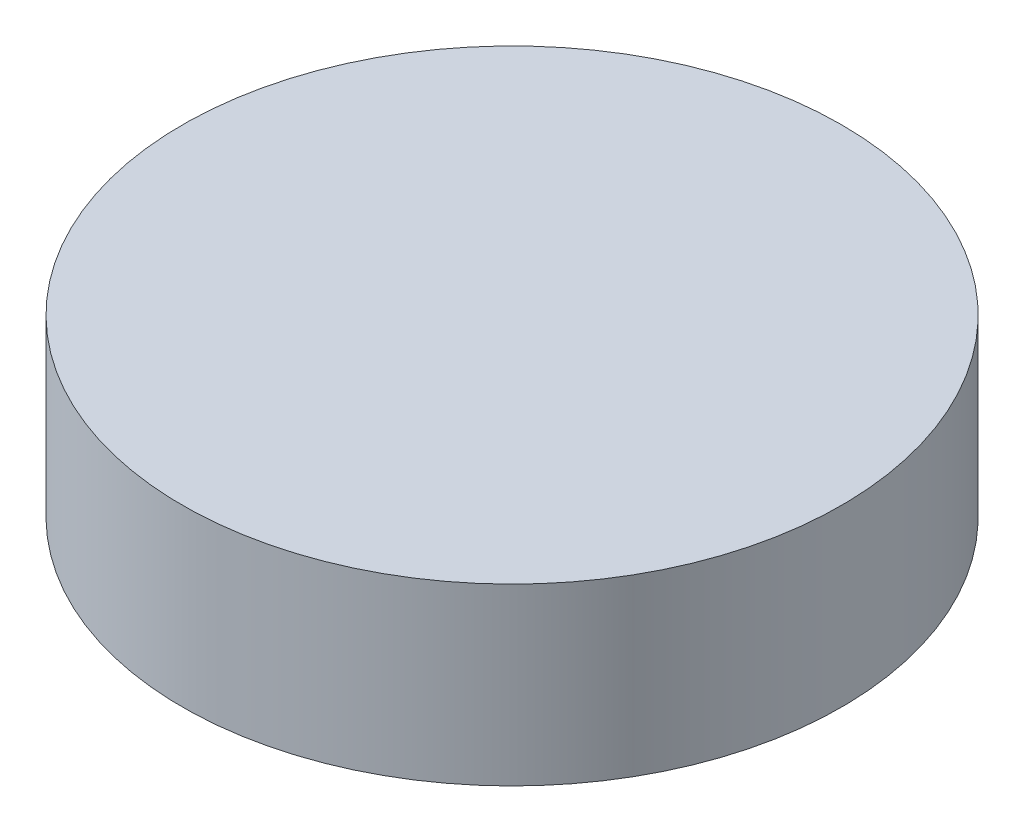
ISO-10303-21;
HEADER;
FILE_DESCRIPTION(('STEP AP214'),'2;1');
FILE_NAME('part.step','',(''),(''),'','','');
FILE_SCHEMA(('AUTOMOTIVE_DESIGN { 1 0 10303 214 1 1 1 1 }'));
ENDSEC;
DATA;
#1=APPLICATION_CONTEXT('core data for automotive mechanical design processes');
#2=APPLICATION_PROTOCOL_DEFINITION('international standard','automotive_design',2000,#1);
#3=PRODUCT_CONTEXT('',#1,'mechanical');
#4=PRODUCT('Part','Part','',(#3));
#5=PRODUCT_RELATED_PRODUCT_CATEGORY('part','',(#4));
#6=PRODUCT_DEFINITION_FORMATION('','',#4);
#7=PRODUCT_DEFINITION_CONTEXT('part definition',#1,'design');
#8=PRODUCT_DEFINITION('design','',#6,#7);
#9=PRODUCT_DEFINITION_SHAPE('','',#8);
#10=(LENGTH_UNIT() NAMED_UNIT(*) SI_UNIT(.MILLI.,.METRE.));
#11=(NAMED_UNIT(*) PLANE_ANGLE_UNIT() SI_UNIT($,.RADIAN.));
#12=(NAMED_UNIT(*) SI_UNIT($,.STERADIAN.) SOLID_ANGLE_UNIT());
#13=UNCERTAINTY_MEASURE_WITH_UNIT(LENGTH_MEASURE(1.E-05),#10,'distance_accuracy_value','');
#14=(GEOMETRIC_REPRESENTATION_CONTEXT(3) GLOBAL_UNCERTAINTY_ASSIGNED_CONTEXT((#13)) GLOBAL_UNIT_ASSIGNED_CONTEXT((#10,
#11,#12)) REPRESENTATION_CONTEXT('',''));
#15=CARTESIAN_POINT('',(0.,0.,0.));
#16=DIRECTION('',(0.,0.,1.));
#17=DIRECTION('',(1.,0.,0.));
#18=AXIS2_PLACEMENT_3D('',#15,#16,#17);
#19=CARTESIAN_POINT('',(0.,15.25,0.));
#20=DIRECTION('',(0.,-1.,0.));
#21=DIRECTION('',(0.,0.,-1.));
#22=AXIS2_PLACEMENT_3D('',#19,#20,#21);
#23=CYLINDRICAL_SURFACE('',#22,28.75);
#24=CARTESIAN_POINT('',(0.,15.25,0.));
#25=DIRECTION('',(0.,1.,0.));
#26=DIRECTION('',(0.,0.,1.));
#27=AXIS2_PLACEMENT_3D('',#24,#25,#26);
#28=CIRCLE('',#27,28.75);
#29=CARTESIAN_POINT('',(0.,15.25,-28.75));
#30=VERTEX_POINT('',#29);
#31=EDGE_CURVE('E10',#30,#30,#28,.T.);
#32=CARTESIAN_POINT('',(0.,0.,0.));
#33=DIRECTION('',(0.,1.,0.));
#34=DIRECTION('',(0.,0.,1.));
#35=AXIS2_PLACEMENT_3D('',#32,#33,#34);
#36=CIRCLE('',#35,28.75);
#37=CARTESIAN_POINT('',(0.,0.,-28.75));
#38=VERTEX_POINT('',#37);
#39=EDGE_CURVE('E40',#38,#38,#36,.T.);
#40=CARTESIAN_POINT('',(0.,15.25,-28.75));
#41=CARTESIAN_POINT('',(0.,15.0911458333333,-28.75));
#42=CARTESIAN_POINT('',(0.,14.9322916666667,-28.75));
#43=CARTESIAN_POINT('',(0.,14.6145833333333,-28.75));
#44=CARTESIAN_POINT('',(0.,14.4557291666667,-28.75));
#45=CARTESIAN_POINT('',(0.,14.1380208333333,-28.75));
#46=CARTESIAN_POINT('',(0.,13.9791666666667,-28.75));
#47=CARTESIAN_POINT('',(0.,13.6614583333333,-28.75));
#48=CARTESIAN_POINT('',(0.,13.5026041666667,-28.75));
#49=CARTESIAN_POINT('',(0.,13.1848958333333,-28.75));
#50=CARTESIAN_POINT('',(0.,13.0260416666667,-28.75));
#51=CARTESIAN_POINT('',(0.,12.7083333333333,-28.75));
#52=CARTESIAN_POINT('',(0.,12.5494791666667,-28.75));
#53=CARTESIAN_POINT('',(0.,12.2317708333333,-28.75));
#54=CARTESIAN_POINT('',(0.,12.0729166666667,-28.75));
#55=CARTESIAN_POINT('',(0.,11.7552083333333,-28.75));
#56=CARTESIAN_POINT('',(0.,11.5963541666667,-28.75));
#57=CARTESIAN_POINT('',(0.,11.2786458333333,-28.75));
#58=CARTESIAN_POINT('',(0.,11.1197916666667,-28.75));
#59=CARTESIAN_POINT('',(0.,10.8020833333333,-28.75));
#60=CARTESIAN_POINT('',(0.,10.6432291666667,-28.75));
#61=CARTESIAN_POINT('',(0.,10.3255208333333,-28.75));
#62=CARTESIAN_POINT('',(0.,10.1666666666667,-28.75));
#63=CARTESIAN_POINT('',(0.,9.84895833333333,-28.75));
#64=CARTESIAN_POINT('',(0.,9.69010416666666,-28.75));
#65=CARTESIAN_POINT('',(0.,9.37239583333333,-28.75));
#66=CARTESIAN_POINT('',(0.,9.21354166666666,-28.75));
#67=CARTESIAN_POINT('',(0.,8.89583333333333,-28.75));
#68=CARTESIAN_POINT('',(0.,8.73697916666667,-28.75));
#69=CARTESIAN_POINT('',(0.,8.41927083333333,-28.75));
#70=CARTESIAN_POINT('',(0.,8.26041666666667,-28.75));
#71=CARTESIAN_POINT('',(0.,7.94270833333333,-28.75));
#72=CARTESIAN_POINT('',(0.,7.78385416666667,-28.75));
#73=CARTESIAN_POINT('',(0.,7.46614583333333,-28.75));
#74=CARTESIAN_POINT('',(0.,7.30729166666667,-28.75));
#75=CARTESIAN_POINT('',(0.,6.98958333333333,-28.75));
#76=CARTESIAN_POINT('',(0.,6.83072916666667,-28.75));
#77=CARTESIAN_POINT('',(0.,6.51302083333333,-28.75));
#78=CARTESIAN_POINT('',(0.,6.35416666666667,-28.75));
#79=CARTESIAN_POINT('',(0.,6.03645833333333,-28.75));
#80=CARTESIAN_POINT('',(0.,5.87760416666667,-28.75));
#81=CARTESIAN_POINT('',(0.,5.55989583333333,-28.75));
#82=CARTESIAN_POINT('',(0.,5.40104166666667,-28.75));
#83=CARTESIAN_POINT('',(0.,5.08333333333333,-28.75));
#84=CARTESIAN_POINT('',(0.,4.92447916666667,-28.75));
#85=CARTESIAN_POINT('',(0.,4.60677083333333,-28.75));
#86=CARTESIAN_POINT('',(0.,4.44791666666667,-28.75));
#87=CARTESIAN_POINT('',(0.,4.13020833333333,-28.75));
#88=CARTESIAN_POINT('',(0.,3.97135416666667,-28.75));
#89=CARTESIAN_POINT('',(0.,3.65364583333333,-28.75));
#90=CARTESIAN_POINT('',(0.,3.49479166666667,-28.75));
#91=CARTESIAN_POINT('',(0.,3.17708333333333,-28.75));
#92=CARTESIAN_POINT('',(0.,3.01822916666667,-28.75));
#93=CARTESIAN_POINT('',(0.,2.70052083333333,-28.75));
#94=CARTESIAN_POINT('',(0.,2.54166666666667,-28.75));
#95=CARTESIAN_POINT('',(0.,2.22395833333333,-28.75));
#96=CARTESIAN_POINT('',(0.,2.06510416666667,-28.75));
#97=CARTESIAN_POINT('',(0.,1.74739583333333,-28.75));
#98=CARTESIAN_POINT('',(0.,1.58854166666667,-28.75));
#99=CARTESIAN_POINT('',(0.,1.27083333333333,-28.75));
#100=CARTESIAN_POINT('',(0.,1.11197916666667,-28.75));
#101=CARTESIAN_POINT('',(0.,0.794270833333332,-28.75));
#102=CARTESIAN_POINT('',(0.,0.635416666666665,-28.75));
#103=CARTESIAN_POINT('',(0.,0.317708333333331,-28.75));
#104=CARTESIAN_POINT('',(0.,0.158854166666665,-28.75));
#105=CARTESIAN_POINT('',(0.,0.,-28.75));
#106=B_SPLINE_CURVE_WITH_KNOTS('',3,(#40,#41,#42,#43,#44,#45,#46,#47,#48,#49,#50,#51,#52,#53,
#54,#55,#56,#57,#58,#59,#60,#61,#62,#63,#64,#65,#66,#67,#68,#69,#70,#71,#72,#73,#74,#75,#76,#77,
#78,#79,#80,#81,#82,#83,#84,#85,#86,#87,#88,#89,#90,#91,#92,#93,#94,#95,#96,#97,#98,#99,#100,
#101,#102,#103,#104,#105),.UNSPECIFIED.,.F.,.F.,(4,2,2,2,2,2,2,2,2,2,2,2,2,2,2,2,2,2,2,2,2,2,2,
2,2,2,2,2,2,2,2,2,4),(0.,0.476562500000001,0.953125000000001,1.4296875,1.90625,2.3828125,
2.859375,3.3359375,3.8125,4.2890625,4.765625,5.2421875,5.71875,6.1953125,6.671875,7.1484375,
7.625,8.1015625,8.578125,9.0546875,9.53125,10.0078125,10.484375,10.9609375,11.4375,11.9140625,
12.390625,12.8671875,13.34375,13.8203125,14.296875,14.7734375,15.25),.UNSPECIFIED.);
#107=EDGE_CURVE('BSEAM37',#30,#38,#106,.T.);
#108=ORIENTED_EDGE('',*,*,#31,.F.);
#109=ORIENTED_EDGE('',*,*,#39,.T.);
#110=ORIENTED_EDGE('',*,*,#107,.T.);
#111=ORIENTED_EDGE('',*,*,#107,.F.);
#112=EDGE_LOOP('',(#108,#110,#109,#111));
#113=FACE_BOUND('',#112,.T.);
#114=ADVANCED_FACE('F37',(#113),#23,.T.);
#115=CARTESIAN_POINT('',(0.,15.25,0.));
#116=DIRECTION('',(0.,1.,0.));
#117=DIRECTION('',(0.,0.,1.));
#118=AXIS2_PLACEMENT_3D('',#115,#116,#117);
#119=PLANE('',#118);
#120=ORIENTED_EDGE('',*,*,#31,.T.);
#121=EDGE_LOOP('',(#120));
#122=FACE_BOUND('',#121,.T.);
#123=ADVANCED_FACE('F68',(#122),#119,.T.);
#124=CARTESIAN_POINT('',(0.,0.,0.));
#125=DIRECTION('',(0.,1.,0.));
#126=DIRECTION('',(0.,0.,1.));
#127=AXIS2_PLACEMENT_3D('',#124,#125,#126);
#128=PLANE('',#127);
#129=CARTESIAN_POINT('',(0.,0.,0.));
#130=DIRECTION('',(0.,1.,0.));
#131=DIRECTION('',(0.,0.,1.));
#132=AXIS2_PLACEMENT_3D('',#129,#130,#131);
#133=CIRCLE('',#132,25.75);
#134=CARTESIAN_POINT('',(0.,0.,-25.75));
#135=VERTEX_POINT('',#134);
#136=EDGE_CURVE('E49',#135,#135,#133,.T.);
#137=ORIENTED_EDGE('',*,*,#136,.T.);
#138=EDGE_LOOP('',(#137));
#139=FACE_BOUND('',#138,.T.);
#140=ORIENTED_EDGE('',*,*,#39,.F.);
#141=EDGE_LOOP('',(#140));
#142=FACE_BOUND('',#141,.T.);
#143=ADVANCED_FACE('F64',(#139,#142),#128,.F.);
#144=CARTESIAN_POINT('',(0.,15.25,0.));
#145=DIRECTION('',(0.,-1.,0.));
#146=DIRECTION('',(0.,0.,-1.));
#147=AXIS2_PLACEMENT_3D('',#144,#145,#146);
#148=CYLINDRICAL_SURFACE('',#147,25.75);
#149=CARTESIAN_POINT('',(0.,12.25,0.));
#150=DIRECTION('',(0.,1.,0.));
#151=DIRECTION('',(0.,0.,1.));
#152=AXIS2_PLACEMENT_3D('',#149,#150,#151);
#153=CIRCLE('',#152,25.75);
#154=CARTESIAN_POINT('',(0.,12.25,-25.75));
#155=VERTEX_POINT('',#154);
#156=EDGE_CURVE('E47',#155,#155,#153,.T.);
#157=CARTESIAN_POINT('',(0.,12.25,-25.75));
#158=CARTESIAN_POINT('',(0.,12.1223958333333,-25.75));
#159=CARTESIAN_POINT('',(0.,11.9947916666667,-25.75));
#160=CARTESIAN_POINT('',(0.,11.7395833333333,-25.75));
#161=CARTESIAN_POINT('',(0.,11.6119791666667,-25.75));
#162=CARTESIAN_POINT('',(0.,11.3567708333333,-25.75));
#163=CARTESIAN_POINT('',(0.,11.2291666666667,-25.75));
#164=CARTESIAN_POINT('',(0.,10.9739583333333,-25.75));
#165=CARTESIAN_POINT('',(0.,10.8463541666667,-25.75));
#166=CARTESIAN_POINT('',(0.,10.5911458333333,-25.75));
#167=CARTESIAN_POINT('',(0.,10.4635416666667,-25.75));
#168=CARTESIAN_POINT('',(0.,10.2083333333333,-25.75));
#169=CARTESIAN_POINT('',(0.,10.0807291666667,-25.75));
#170=CARTESIAN_POINT('',(0.,9.82552083333333,-25.75));
#171=CARTESIAN_POINT('',(0.,9.69791666666667,-25.75));
#172=CARTESIAN_POINT('',(0.,9.44270833333333,-25.75));
#173=CARTESIAN_POINT('',(0.,9.31510416666666,-25.75));
#174=CARTESIAN_POINT('',(0.,9.05989583333333,-25.75));
#175=CARTESIAN_POINT('',(0.,8.93229166666666,-25.75));
#176=CARTESIAN_POINT('',(0.,8.67708333333333,-25.75));
#177=CARTESIAN_POINT('',(0.,8.54947916666667,-25.75));
#178=CARTESIAN_POINT('',(0.,8.29427083333333,-25.75));
#179=CARTESIAN_POINT('',(0.,8.16666666666667,-25.75));
#180=CARTESIAN_POINT('',(0.,7.91145833333333,-25.75));
#181=CARTESIAN_POINT('',(0.,7.78385416666667,-25.75));
#182=CARTESIAN_POINT('',(0.,7.52864583333333,-25.75));
#183=CARTESIAN_POINT('',(0.,7.40104166666667,-25.75));
#184=CARTESIAN_POINT('',(0.,7.14583333333333,-25.75));
#185=CARTESIAN_POINT('',(0.,7.01822916666667,-25.75));
#186=CARTESIAN_POINT('',(0.,6.76302083333333,-25.75));
#187=CARTESIAN_POINT('',(0.,6.63541666666667,-25.75));
#188=CARTESIAN_POINT('',(0.,6.38020833333333,-25.75));
#189=CARTESIAN_POINT('',(0.,6.25260416666667,-25.75));
#190=CARTESIAN_POINT('',(0.,5.99739583333333,-25.75));
#191=CARTESIAN_POINT('',(0.,5.86979166666667,-25.75));
#192=CARTESIAN_POINT('',(0.,5.61458333333333,-25.75));
#193=CARTESIAN_POINT('',(0.,5.48697916666667,-25.75));
#194=CARTESIAN_POINT('',(0.,5.23177083333333,-25.75));
#195=CARTESIAN_POINT('',(0.,5.10416666666667,-25.75));
#196=CARTESIAN_POINT('',(0.,4.84895833333333,-25.75));
#197=CARTESIAN_POINT('',(0.,4.72135416666667,-25.75));
#198=CARTESIAN_POINT('',(0.,4.46614583333333,-25.75));
#199=CARTESIAN_POINT('',(0.,4.33854166666667,-25.75));
#200=CARTESIAN_POINT('',(0.,4.08333333333333,-25.75));
#201=CARTESIAN_POINT('',(0.,3.95572916666667,-25.75));
#202=CARTESIAN_POINT('',(0.,3.70052083333333,-25.75));
#203=CARTESIAN_POINT('',(0.,3.57291666666667,-25.75));
#204=CARTESIAN_POINT('',(0.,3.31770833333333,-25.75));
#205=CARTESIAN_POINT('',(0.,3.19010416666667,-25.75));
#206=CARTESIAN_POINT('',(0.,2.93489583333333,-25.75));
#207=CARTESIAN_POINT('',(0.,2.80729166666667,-25.75));
#208=CARTESIAN_POINT('',(0.,2.55208333333333,-25.75));
#209=CARTESIAN_POINT('',(0.,2.42447916666667,-25.75));
#210=CARTESIAN_POINT('',(0.,2.16927083333333,-25.75));
#211=CARTESIAN_POINT('',(0.,2.04166666666667,-25.75));
#212=CARTESIAN_POINT('',(0.,1.78645833333333,-25.75));
#213=CARTESIAN_POINT('',(0.,1.65885416666666,-25.75));
#214=CARTESIAN_POINT('',(0.,1.40364583333333,-25.75));
#215=CARTESIAN_POINT('',(0.,1.27604166666666,-25.75));
#216=CARTESIAN_POINT('',(0.,1.02083333333333,-25.75));
#217=CARTESIAN_POINT('',(0.,0.893229166666665,-25.75));
#218=CARTESIAN_POINT('',(0.,0.638020833333332,-25.75));
#219=CARTESIAN_POINT('',(0.,0.510416666666665,-25.75));
#220=CARTESIAN_POINT('',(0.,0.255208333333331,-25.75));
#221=CARTESIAN_POINT('',(0.,0.127604166666665,-25.75));
#222=CARTESIAN_POINT('',(0.,0.,-25.75));
#223=B_SPLINE_CURVE_WITH_KNOTS('',3,(#157,#158,#159,#160,#161,#162,#163,#164,#165,#166,#167,
#168,#169,#170,#171,#172,#173,#174,#175,#176,#177,#178,#179,#180,#181,#182,#183,#184,#185,#186,
#187,#188,#189,#190,#191,#192,#193,#194,#195,#196,#197,#198,#199,#200,#201,#202,#203,#204,#205,
#206,#207,#208,#209,#210,#211,#212,#213,#214,#215,#216,#217,#218,#219,#220,#221,#222),
.UNSPECIFIED.,.F.,.F.,(4,2,2,2,2,2,2,2,2,2,2,2,2,2,2,2,2,2,2,2,2,2,2,2,2,2,2,2,2,2,2,2,4),(0.,
0.382812499999999,0.765625000000001,1.1484375,1.53125,1.9140625,2.296875,2.6796875,3.0625,
3.4453125,3.828125,4.2109375,4.59375,4.9765625,5.359375,5.7421875,6.125,6.5078125,6.890625,
7.2734375,7.65625,8.0390625,8.421875,8.8046875,9.1875,9.5703125,9.953125,10.3359375,10.71875,
11.1015625,11.484375,11.8671875,12.25),.UNSPECIFIED.);
#224=EDGE_CURVE('BSEAM55',#155,#135,#223,.T.);
#225=ORIENTED_EDGE('',*,*,#156,.T.);
#226=ORIENTED_EDGE('',*,*,#136,.F.);
#227=ORIENTED_EDGE('',*,*,#224,.T.);
#228=ORIENTED_EDGE('',*,*,#224,.F.);
#229=EDGE_LOOP('',(#225,#227,#226,#228));
#230=FACE_BOUND('',#229,.T.);
#231=ADVANCED_FACE('F55',(#230),#148,.F.);
#232=CARTESIAN_POINT('',(0.,12.25,0.));
#233=DIRECTION('',(0.,1.,0.));
#234=DIRECTION('',(0.,0.,1.));
#235=AXIS2_PLACEMENT_3D('',#232,#233,#234);
#236=PLANE('',#235);
#237=ORIENTED_EDGE('',*,*,#156,.F.);
#238=EDGE_LOOP('',(#237));
#239=FACE_BOUND('',#238,.T.);
#240=ADVANCED_FACE('F58',(#239),#236,.F.);
#241=CLOSED_SHELL('',(#114,#123,#143,#231,#240));
#242=MANIFOLD_SOLID_BREP('B2',#241);
#243=ADVANCED_BREP_SHAPE_REPRESENTATION('',(#18,#242),#14);
#244=SHAPE_DEFINITION_REPRESENTATION(#9,#243);
ENDSEC;
END-ISO-10303-21;
